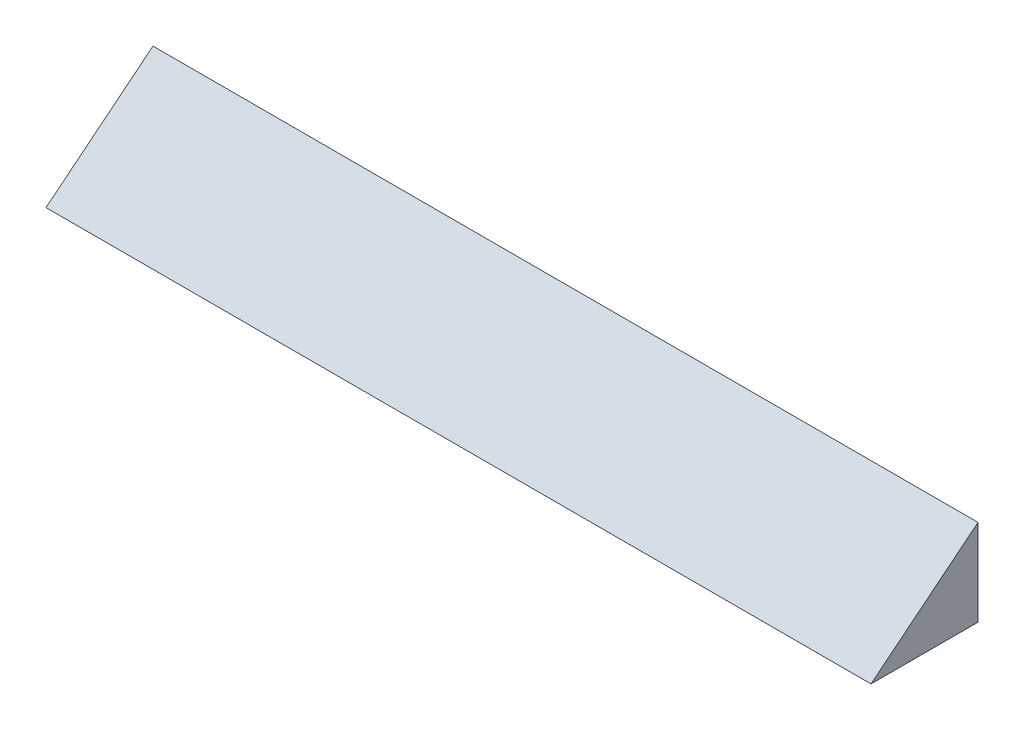
ISO-10303-21;
HEADER;
FILE_DESCRIPTION(('STEP AP214'),'2;1');
FILE_NAME('part.step','',(''),(''),'','','');
FILE_SCHEMA(('AUTOMOTIVE_DESIGN { 1 0 10303 214 1 1 1 1 }'));
ENDSEC;
DATA;
#1=APPLICATION_CONTEXT('core data for automotive mechanical design processes');
#2=APPLICATION_PROTOCOL_DEFINITION('international standard','automotive_design',2000,#1);
#3=PRODUCT_CONTEXT('',#1,'mechanical');
#4=PRODUCT('Part','Part','',(#3));
#5=PRODUCT_RELATED_PRODUCT_CATEGORY('part','',(#4));
#6=PRODUCT_DEFINITION_FORMATION('','',#4);
#7=PRODUCT_DEFINITION_CONTEXT('part definition',#1,'design');
#8=PRODUCT_DEFINITION('design','',#6,#7);
#9=PRODUCT_DEFINITION_SHAPE('','',#8);
#10=(LENGTH_UNIT() NAMED_UNIT(*) SI_UNIT(.MILLI.,.METRE.));
#11=(NAMED_UNIT(*) PLANE_ANGLE_UNIT() SI_UNIT($,.RADIAN.));
#12=(NAMED_UNIT(*) SI_UNIT($,.STERADIAN.) SOLID_ANGLE_UNIT());
#13=UNCERTAINTY_MEASURE_WITH_UNIT(LENGTH_MEASURE(1.E-05),#10,'distance_accuracy_value','');
#14=(GEOMETRIC_REPRESENTATION_CONTEXT(3) GLOBAL_UNCERTAINTY_ASSIGNED_CONTEXT((#13)) GLOBAL_UNIT_ASSIGNED_CONTEXT((#10,
#11,#12)) REPRESENTATION_CONTEXT('',''));
#15=CARTESIAN_POINT('',(0.,0.,0.));
#16=DIRECTION('',(0.,0.,1.));
#17=DIRECTION('',(1.,0.,0.));
#18=AXIS2_PLACEMENT_3D('',#15,#16,#17);
#19=CARTESIAN_POINT('',(914.4,5.83791787658897,44.6965587426343));
#20=DIRECTION('',(0.,1.,0.));
#21=DIRECTION('',(0.,0.,1.));
#22=AXIS2_PLACEMENT_3D('',#19,#20,#21);
#23=PLANE('',#22);
#24=DIRECTION('',(0.,0.,-1.));
#25=VECTOR('',#24,1.);
#26=CARTESIAN_POINT('',(0.,5.83791787658897,44.6965587426343));
#27=LINE('',#26,#25);
#28=CARTESIAN_POINT('',(0.,5.83791787658897,44.6965587426343));
#29=VERTEX_POINT('',#28);
#30=CARTESIAN_POINT('',(0.,5.83791787658897,-73.8616771204129));
#31=VERTEX_POINT('',#30);
#32=EDGE_CURVE('E88',#29,#31,#27,.T.);
#33=ORIENTED_EDGE('',*,*,#32,.T.);
#34=DIRECTION('',(-1.,0.,0.));
#35=VECTOR('',#34,1.);
#36=CARTESIAN_POINT('',(914.4,5.83791787658897,-73.8616771204129));
#37=LINE('',#36,#35);
#38=CARTESIAN_POINT('',(914.4,5.83791787658897,-73.8616771204129));
#39=VERTEX_POINT('',#38);
#40=EDGE_CURVE('E11',#39,#31,#37,.T.);
#41=ORIENTED_EDGE('',*,*,#40,.F.);
#42=DIRECTION('',(0.,0.,-1.));
#43=VECTOR('',#42,1.);
#44=CARTESIAN_POINT('',(914.4,5.83791787658897,44.6965587426343));
#45=LINE('',#44,#43);
#46=CARTESIAN_POINT('',(914.4,5.83791787658897,44.6965587426343));
#47=VERTEX_POINT('',#46);
#48=EDGE_CURVE('E82',#47,#39,#45,.T.);
#49=ORIENTED_EDGE('',*,*,#48,.F.);
#50=DIRECTION('',(-1.,0.,0.));
#51=VECTOR('',#50,1.);
#52=CARTESIAN_POINT('',(914.4,5.83791787658897,44.6965587426343));
#53=LINE('',#52,#51);
#54=EDGE_CURVE('E56',#47,#29,#53,.T.);
#55=ORIENTED_EDGE('',*,*,#54,.T.);
#56=EDGE_LOOP('',(#33,#41,#49,#55));
#57=FACE_BOUND('',#56,.T.);
#58=ADVANCED_FACE('F39',(#57),#23,.F.);
#59=CARTESIAN_POINT('',(914.4,5.83791787658897,-73.8616771204129));
#60=DIRECTION('',(0.,0.,1.));
#61=DIRECTION('',(1.,0.,0.));
#62=AXIS2_PLACEMENT_3D('',#59,#60,#61);
#63=PLANE('',#62);
#64=DIRECTION('',(0.,1.,0.));
#65=VECTOR('',#64,1.);
#66=CARTESIAN_POINT('',(0.,5.83791787658897,-73.8616771204129));
#67=LINE('',#66,#65);
#68=CARTESIAN_POINT('',(0.,101.596492996742,-73.8616771204129));
#69=VERTEX_POINT('',#68);
#70=EDGE_CURVE('E92',#31,#69,#67,.T.);
#71=ORIENTED_EDGE('',*,*,#70,.T.);
#72=DIRECTION('',(-1.,0.,0.));
#73=VECTOR('',#72,1.);
#74=CARTESIAN_POINT('',(914.4,101.596492996742,-73.8616771204129));
#75=LINE('',#74,#73);
#76=CARTESIAN_POINT('',(914.4,101.596492996742,-73.8616771204129));
#77=VERTEX_POINT('',#76);
#78=EDGE_CURVE('E48',#77,#69,#75,.T.);
#79=ORIENTED_EDGE('',*,*,#78,.F.);
#80=DIRECTION('',(0.,1.,0.));
#81=VECTOR('',#80,1.);
#82=CARTESIAN_POINT('',(914.4,5.83791787658897,-73.8616771204129));
#83=LINE('',#82,#81);
#84=EDGE_CURVE('E74',#39,#77,#83,.T.);
#85=ORIENTED_EDGE('',*,*,#84,.F.);
#86=ORIENTED_EDGE('',*,*,#40,.T.);
#87=EDGE_LOOP('',(#71,#79,#85,#86));
#88=FACE_BOUND('',#87,.T.);
#89=ADVANCED_FACE('F76',(#88),#63,.F.);
#90=CARTESIAN_POINT('',(914.4,5.83791787658897,44.6965587426343));
#91=DIRECTION('',(0.,0.777941180203722,0.628337107087621));
#92=DIRECTION('',(0.,-0.628337107087621,0.777941180203722));
#93=AXIS2_PLACEMENT_3D('',#90,#91,#92);
#94=PLANE('',#93);
#95=DIRECTION('',(0.,0.628337107087621,-0.777941180203721));
#96=VECTOR('',#95,1.);
#97=CARTESIAN_POINT('',(0.,5.83791787658897,44.6965587426343));
#98=LINE('',#97,#96);
#99=EDGE_CURVE('E86',#29,#69,#98,.T.);
#100=ORIENTED_EDGE('',*,*,#99,.F.);
#101=ORIENTED_EDGE('',*,*,#54,.F.);
#102=DIRECTION('',(0.,0.628337107087621,-0.777941180203721));
#103=VECTOR('',#102,1.);
#104=CARTESIAN_POINT('',(914.4,5.83791787658897,44.6965587426343));
#105=LINE('',#104,#103);
#106=EDGE_CURVE('E81',#47,#77,#105,.T.);
#107=ORIENTED_EDGE('',*,*,#106,.T.);
#108=ORIENTED_EDGE('',*,*,#78,.T.);
#109=EDGE_LOOP('',(#100,#101,#107,#108));
#110=FACE_BOUND('',#109,.T.);
#111=ADVANCED_FACE('F103',(#110),#94,.T.);
#112=CARTESIAN_POINT('',(914.4,0.,0.));
#113=DIRECTION('',(1.,0.,0.));
#114=DIRECTION('',(0.,0.,-1.));
#115=AXIS2_PLACEMENT_3D('',#112,#113,#114);
#116=PLANE('',#115);
#117=ORIENTED_EDGE('',*,*,#48,.T.);
#118=ORIENTED_EDGE('',*,*,#84,.T.);
#119=ORIENTED_EDGE('',*,*,#106,.F.);
#120=EDGE_LOOP('',(#117,#118,#119));
#121=FACE_BOUND('',#120,.T.);
#122=ADVANCED_FACE('F84',(#121),#116,.T.);
#123=CARTESIAN_POINT('',(0.,0.,0.));
#124=DIRECTION('',(1.,0.,0.));
#125=DIRECTION('',(0.,0.,-1.));
#126=AXIS2_PLACEMENT_3D('',#123,#124,#125);
#127=PLANE('',#126);
#128=ORIENTED_EDGE('',*,*,#32,.F.);
#129=ORIENTED_EDGE('',*,*,#99,.T.);
#130=ORIENTED_EDGE('',*,*,#70,.F.);
#131=EDGE_LOOP('',(#128,#129,#130));
#132=FACE_BOUND('',#131,.T.);
#133=ADVANCED_FACE('F110',(#132),#127,.F.);
#134=CLOSED_SHELL('',(#58,#89,#111,#122,#133));
#135=MANIFOLD_SOLID_BREP('B2',#134);
#136=ADVANCED_BREP_SHAPE_REPRESENTATION('',(#18,#135),#14);
#137=SHAPE_DEFINITION_REPRESENTATION(#9,#136);
ENDSEC;
END-ISO-10303-21;
